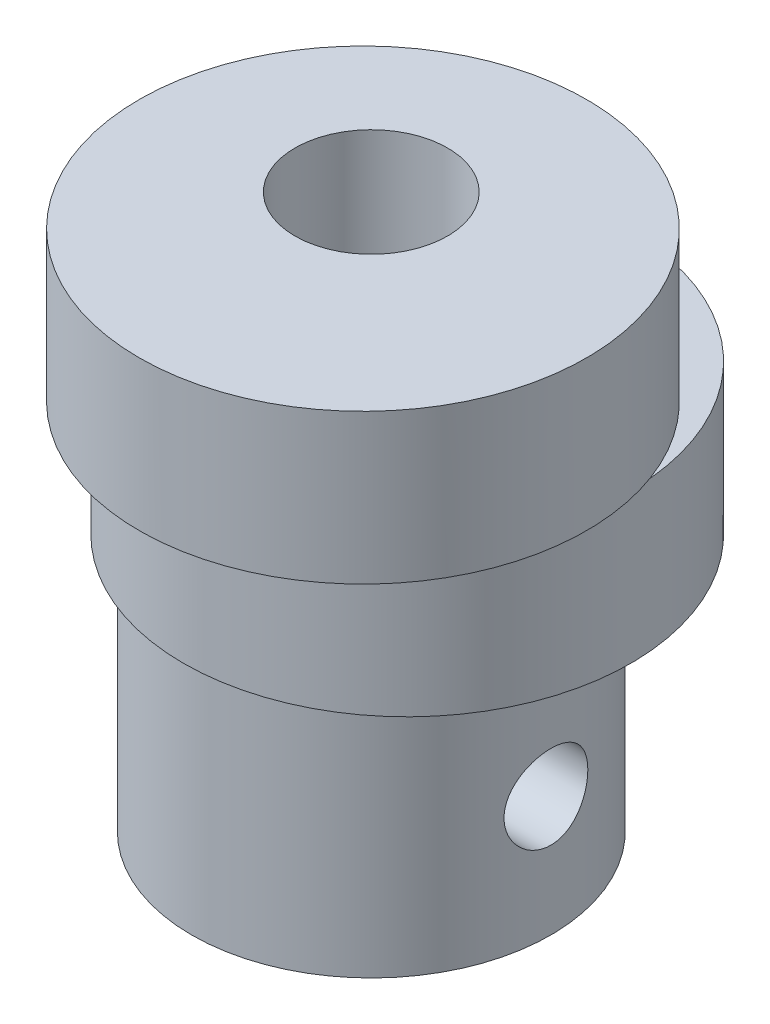
ISO-10303-21;
HEADER;
FILE_DESCRIPTION(('STEP AP214'),'2;1');
FILE_NAME('part.step','',(''),(''),'','','');
FILE_SCHEMA(('AUTOMOTIVE_DESIGN { 1 0 10303 214 1 1 1 1 }'));
ENDSEC;
DATA;
#1=APPLICATION_CONTEXT('core data for automotive mechanical design processes');
#2=APPLICATION_PROTOCOL_DEFINITION('international standard','automotive_design',2000,#1);
#3=PRODUCT_CONTEXT('',#1,'mechanical');
#4=PRODUCT('Part','Part','',(#3));
#5=PRODUCT_RELATED_PRODUCT_CATEGORY('part','',(#4));
#6=PRODUCT_DEFINITION_FORMATION('','',#4);
#7=PRODUCT_DEFINITION_CONTEXT('part definition',#1,'design');
#8=PRODUCT_DEFINITION('design','',#6,#7);
#9=PRODUCT_DEFINITION_SHAPE('','',#8);
#10=(LENGTH_UNIT() NAMED_UNIT(*) SI_UNIT(.MILLI.,.METRE.));
#11=(NAMED_UNIT(*) PLANE_ANGLE_UNIT() SI_UNIT($,.RADIAN.));
#12=(NAMED_UNIT(*) SI_UNIT($,.STERADIAN.) SOLID_ANGLE_UNIT());
#13=UNCERTAINTY_MEASURE_WITH_UNIT(LENGTH_MEASURE(1.E-05),#10,'distance_accuracy_value','');
#14=(GEOMETRIC_REPRESENTATION_CONTEXT(3) GLOBAL_UNCERTAINTY_ASSIGNED_CONTEXT((#13)) GLOBAL_UNIT_ASSIGNED_CONTEXT((#10,
#11,#12)) REPRESENTATION_CONTEXT('',''));
#15=CARTESIAN_POINT('',(0.,0.,0.));
#16=DIRECTION('',(0.,0.,1.));
#17=DIRECTION('',(1.,0.,0.));
#18=AXIS2_PLACEMENT_3D('',#15,#16,#17);
#19=CARTESIAN_POINT('',(0.,8.,0.));
#20=DIRECTION('',(0.,-1.,0.));
#21=DIRECTION('',(0.,0.,-1.));
#22=AXIS2_PLACEMENT_3D('',#19,#20,#21);
#23=CYLINDRICAL_SURFACE('',#22,6.);
#24=CARTESIAN_POINT('',(-5.83438085832593,4.,-1.4));
#25=CARTESIAN_POINT('',(-5.83438240713305,4.07748127009628,-1.39999752897121));
#26=CARTESIAN_POINT('',(-5.83594113113471,4.15499113191502,-1.39354594762189));
#27=CARTESIAN_POINT('',(-5.84199416300749,4.30779688786216,-1.36794409538363));
#28=CARTESIAN_POINT('',(-5.84649040504597,4.38309128909226,-1.34878545758606));
#29=CARTESIAN_POINT('',(-5.85788215378785,4.52923375884606,-1.29841363127606));
#30=CARTESIAN_POINT('',(-5.86477481840199,4.60008697752087,-1.26721471739009));
#31=CARTESIAN_POINT('',(-5.88017931416204,4.73555802594805,-1.19369008059532));
#32=CARTESIAN_POINT('',(-5.88869115868398,4.80017580418284,-1.15136426576614));
#33=CARTESIAN_POINT('',(-5.90655766331575,4.92258246312702,-1.05592042422923));
#34=CARTESIAN_POINT('',(-5.91592434176156,4.98023411003338,-1.00262861273496));
#35=CARTESIAN_POINT('',(-5.93434035204426,5.08586688279051,-0.887140338106091));
#36=CARTESIAN_POINT('',(-5.94338965698452,5.13384719064705,-0.824943122519716));
#37=CARTESIAN_POINT('',(-5.96028315816151,5.21932659709147,-0.692480344845557));
#38=CARTESIAN_POINT('',(-5.96811151728704,5.25669241741224,-0.622126583128503));
#39=CARTESIAN_POINT('',(-5.98154471284947,5.31901797306193,-0.475924410658289));
#40=CARTESIAN_POINT('',(-5.98714983396844,5.34397929687038,-0.400076704867757));
#41=CARTESIAN_POINT('',(-5.99542006442471,5.38035207007691,-0.246468422948656));
#42=CARTESIAN_POINT('',(-5.99813559050782,5.39199615381926,-0.168765692836243));
#43=CARTESIAN_POINT('',(-6.00049580147819,5.40213256194694,-0.0124654307432515));
#44=CARTESIAN_POINT('',(-6.000140884059,5.40062658956885,0.0661319840379752));
#45=CARTESIAN_POINT('',(-5.99643827775144,5.38467621607323,0.22038243403317));
#46=CARTESIAN_POINT('',(-5.9931486277782,5.37048271968994,0.296063014483886));
#47=CARTESIAN_POINT('',(-5.98401294997535,5.32996158795322,0.443937351340516));
#48=CARTESIAN_POINT('',(-5.97816679666005,5.30363335696424,0.516130936394457));
#49=CARTESIAN_POINT('',(-5.96448369445457,5.23937681779177,0.655662411374694));
#50=CARTESIAN_POINT('',(-5.95663096457973,5.20135604592128,0.722956109240957));
#51=CARTESIAN_POINT('',(-5.93979166468828,5.11486315175258,0.850298043438957));
#52=CARTESIAN_POINT('',(-5.93080492066729,5.0663894247306,0.910345165075966));
#53=CARTESIAN_POINT('',(-5.91243116839085,4.95900986814144,1.02298382065534));
#54=CARTESIAN_POINT('',(-5.90303972002647,4.89988454653532,1.0753655893591));
#55=CARTESIAN_POINT('',(-5.88511193509137,4.77359071209639,1.16951315096307));
#56=CARTESIAN_POINT('',(-5.87657562866398,4.70642191591817,1.21127856972193));
#57=CARTESIAN_POINT('',(-5.86131086901547,4.56557629197206,1.28311928066036));
#58=CARTESIAN_POINT('',(-5.85458932713218,4.49187596565162,1.31315007157412));
#59=CARTESIAN_POINT('',(-5.84380727037895,4.34027963196071,1.36033399651697));
#60=CARTESIAN_POINT('',(-5.83974626809562,4.26238439593306,1.3774894893968));
#61=CARTESIAN_POINT('',(-5.83484585305818,4.10653908474137,1.39810032473933));
#62=CARTESIAN_POINT('',(-5.8339341319395,4.02863191027216,1.40186322729132));
#63=CARTESIAN_POINT('',(-5.83523964902541,3.87330328697474,1.39641897695547));
#64=CARTESIAN_POINT('',(-5.83745663986124,3.79588180023219,1.38721284945225));
#65=CARTESIAN_POINT('',(-5.84470103750626,3.64482497046983,1.35636003740989));
#66=CARTESIAN_POINT('',(-5.8496891723475,3.57115208493532,1.33488707764707));
#67=CARTESIAN_POINT('',(-5.86187755455804,3.42845039771517,1.28030025935677));
#68=CARTESIAN_POINT('',(-5.86907803707116,3.35942209063901,1.24718516336753));
#69=CARTESIAN_POINT('',(-5.88503566856558,3.22665057854113,1.16959187555837));
#70=CARTESIAN_POINT('',(-5.89381762819068,3.16301967278477,1.12492673697715));
#71=CARTESIAN_POINT('',(-5.91188538119269,3.04404319887724,1.02574210184502));
#72=CARTESIAN_POINT('',(-5.92117124609802,2.98869881119544,0.971221203713207));
#73=CARTESIAN_POINT('',(-5.93944192292914,2.88664918774636,0.85247191256235));
#74=CARTESIAN_POINT('',(-5.94841598440836,2.84015504719718,0.788060164078878));
#75=CARTESIAN_POINT('',(-5.96484373962347,2.75864582524921,0.652162995697992));
#76=CARTESIAN_POINT('',(-5.97229750893382,2.72363017319661,0.580677927681216));
#77=CARTESIAN_POINT('',(-5.98480005739952,2.66635408127874,0.433135725189761));
#78=CARTESIAN_POINT('',(-5.98986510691081,2.64400713336923,0.35711361575605));
#79=CARTESIAN_POINT('',(-5.99709029613555,2.61243681056742,0.202261185265154));
#80=CARTESIAN_POINT('',(-5.9992509199578,2.60321124859157,0.123431334450482));
#81=CARTESIAN_POINT('',(-6.00040699871177,2.59825516605721,-0.0328046344139635));
#82=CARTESIAN_POINT('',(-5.99947597571806,2.60221118367551,-0.110200426877641));
#83=CARTESIAN_POINT('',(-5.99471338137433,2.62279722469367,-0.263191681222009));
#84=CARTESIAN_POINT('',(-5.99088187680089,2.63942695631198,-0.338787184508677));
#85=CARTESIAN_POINT('',(-5.98075700496624,2.68472970825951,-0.485750585480169));
#86=CARTESIAN_POINT('',(-5.97447387330707,2.71335269269399,-0.557134657732929));
#87=CARTESIAN_POINT('',(-5.96011229736764,2.78178262774409,-0.694125881671262));
#88=CARTESIAN_POINT('',(-5.95203365402622,2.82159081854802,-0.759732391694803));
#89=CARTESIAN_POINT('',(-5.93474308040959,2.91225344870422,-0.884816433492555));
#90=CARTESIAN_POINT('',(-5.92551069348074,2.96332490929113,-0.944133846970399));
#91=CARTESIAN_POINT('',(-5.90705477759142,3.07463390254468,-1.05346330371257));
#92=CARTESIAN_POINT('',(-5.89783125136838,3.13487368674433,-1.10347305450114));
#93=CARTESIAN_POINT('',(-5.88027451979457,3.26394663161854,-1.19353045744998));
#94=CARTESIAN_POINT('',(-5.87195754966424,3.33289976705906,-1.23340953731453));
#95=CARTESIAN_POINT('',(-5.85736566955804,3.47671240943205,-1.30094971958484));
#96=CARTESIAN_POINT('',(-5.85108913982645,3.55156717255043,-1.32862051951041));
#97=CARTESIAN_POINT('',(-5.84236938910376,3.68867500034257,-1.36638441859385));
#98=CARTESIAN_POINT('',(-5.83939473958381,3.75022122426246,-1.37896464197831));
#99=CARTESIAN_POINT('',(-5.83539990897484,3.87450543033199,-1.39577316839126));
#100=CARTESIAN_POINT('',(-5.83437960385543,3.93724333659756,-1.40000200143237));
#101=CARTESIAN_POINT('',(-5.83438085832593,4.,-1.4));
#102=B_SPLINE_CURVE_WITH_KNOTS('',3,(#24,#25,#26,#27,#28,#29,#30,#31,#32,#33,#34,#35,#36,#37,
#38,#39,#40,#41,#42,#43,#44,#45,#46,#47,#48,#49,#50,#51,#52,#53,#54,#55,#56,#57,#58,#59,#60,#61,
#62,#63,#64,#65,#66,#67,#68,#69,#70,#71,#72,#73,#74,#75,#76,#77,#78,#79,#80,#81,#82,#83,#84,#85,
#86,#87,#88,#89,#90,#91,#92,#93,#94,#95,#96,#97,#98,#99,#100,#101),.UNSPECIFIED.,.T.,.F.,(4,2,2,
2,2,2,2,2,2,2,2,2,2,2,2,2,2,2,2,2,2,2,2,2,2,2,2,2,2,2,2,2,2,2,2,2,2,2,4),(0.,0.232213611218947,
0.464580274520692,0.696672292323001,0.928766227519193,1.16486909871888,1.40099193094167,
1.63996030370597,1.87889806706619,2.11359490303957,2.34826134079243,2.57838730313738,
2.80852456245816,3.04053068043832,3.27257244107759,3.51009871852548,3.74763336571324,
3.98606027106499,4.22444348415662,4.45731559480039,4.6901692946548,4.91980425978676,
5.14946364057931,5.3831023379425,5.61677428708265,5.85546531594788,6.09414447647271,
6.33117355760682,6.56816312590406,6.79955761512103,7.03094677720145,7.26138004633751,
7.49183887543995,7.72720146781136,7.96262195345586,8.20173528337683,8.44065833264115,
8.62875380868085,8.81683734704598),.UNSPECIFIED.);
#103=CARTESIAN_POINT('',(-5.83438085832593,4.,-1.4));
#104=VERTEX_POINT('',#103);
#105=EDGE_CURVE('E117',#104,#104,#102,.T.);
#106=ORIENTED_EDGE('',*,*,#105,.T.);
#107=EDGE_LOOP('',(#106));
#108=FACE_BOUND('',#107,.T.);
#109=CARTESIAN_POINT('',(5.83438085832593,4.,-1.4));
#110=CARTESIAN_POINT('',(5.83438240713305,3.92251872990372,-1.39999752897121));
#111=CARTESIAN_POINT('',(5.83594113113471,3.84500886808498,-1.39354594762189));
#112=CARTESIAN_POINT('',(5.84199416300749,3.69220311213784,-1.36794409538363));
#113=CARTESIAN_POINT('',(5.84649040504597,3.61690871090774,-1.34878545758606));
#114=CARTESIAN_POINT('',(5.85788215378785,3.47076624115394,-1.29841363127606));
#115=CARTESIAN_POINT('',(5.86477481840199,3.39991302247913,-1.26721471739009));
#116=CARTESIAN_POINT('',(5.88017931416204,3.26444197405195,-1.19369008059532));
#117=CARTESIAN_POINT('',(5.88869115868398,3.19982419581716,-1.15136426576614));
#118=CARTESIAN_POINT('',(5.90655766331575,3.07741753687298,-1.05592042422923));
#119=CARTESIAN_POINT('',(5.91592434176156,3.01976588996662,-1.00262861273496));
#120=CARTESIAN_POINT('',(5.93434035204426,2.91413311720949,-0.887140338106091));
#121=CARTESIAN_POINT('',(5.94338965698452,2.86615280935295,-0.824943122519716));
#122=CARTESIAN_POINT('',(5.96028315816151,2.78067340290853,-0.692480344845558));
#123=CARTESIAN_POINT('',(5.96811151728704,2.74330758258777,-0.622126583128503));
#124=CARTESIAN_POINT('',(5.98154471284947,2.68098202693807,-0.475924410658289));
#125=CARTESIAN_POINT('',(5.98714983396844,2.65602070312962,-0.400076704867757));
#126=CARTESIAN_POINT('',(5.99542006442471,2.61964792992309,-0.246468422948656));
#127=CARTESIAN_POINT('',(5.99813559050782,2.60800384618074,-0.168765692836243));
#128=CARTESIAN_POINT('',(6.00049580147819,2.59786743805306,-0.012465430743252));
#129=CARTESIAN_POINT('',(6.000140884059,2.59937341043115,0.0661319840379747));
#130=CARTESIAN_POINT('',(5.99643827775144,2.61532378392677,0.220382434033169));
#131=CARTESIAN_POINT('',(5.9931486277782,2.62951728031006,0.296063014483886));
#132=CARTESIAN_POINT('',(5.98401294997535,2.67003841204678,0.443937351340515));
#133=CARTESIAN_POINT('',(5.97816679666005,2.69636664303576,0.516130936394457));
#134=CARTESIAN_POINT('',(5.96448369445457,2.76062318220823,0.655662411374694));
#135=CARTESIAN_POINT('',(5.95663096457973,2.79864395407872,0.722956109240957));
#136=CARTESIAN_POINT('',(5.93979166468828,2.88513684824742,0.850298043438957));
#137=CARTESIAN_POINT('',(5.93080492066729,2.9336105752694,0.910345165075965));
#138=CARTESIAN_POINT('',(5.91243116839085,3.04099013185856,1.02298382065534));
#139=CARTESIAN_POINT('',(5.90303972002647,3.10011545346468,1.0753655893591));
#140=CARTESIAN_POINT('',(5.88511193509137,3.22640928790361,1.16951315096307));
#141=CARTESIAN_POINT('',(5.87657562866398,3.29357808408183,1.21127856972193));
#142=CARTESIAN_POINT('',(5.86131086901547,3.43442370802794,1.28311928066036));
#143=CARTESIAN_POINT('',(5.85458932713218,3.50812403434838,1.31315007157412));
#144=CARTESIAN_POINT('',(5.84380727037895,3.65972036803929,1.36033399651696));
#145=CARTESIAN_POINT('',(5.83974626809562,3.73761560406694,1.3774894893968));
#146=CARTESIAN_POINT('',(5.83484585305818,3.89346091525863,1.39810032473933));
#147=CARTESIAN_POINT('',(5.8339341319395,3.97136808972784,1.40186322729132));
#148=CARTESIAN_POINT('',(5.83523964902541,4.12669671302526,1.39641897695547));
#149=CARTESIAN_POINT('',(5.83745663986124,4.20411819976781,1.38721284945225));
#150=CARTESIAN_POINT('',(5.84470103750626,4.35517502953017,1.35636003740989));
#151=CARTESIAN_POINT('',(5.8496891723475,4.42884791506468,1.33488707764707));
#152=CARTESIAN_POINT('',(5.86187755455804,4.57154960228482,1.28030025935678));
#153=CARTESIAN_POINT('',(5.86907803707116,4.64057790936099,1.24718516336753));
#154=CARTESIAN_POINT('',(5.88503566856558,4.77334942145887,1.16959187555837));
#155=CARTESIAN_POINT('',(5.89381762819068,4.83698032721523,1.12492673697715));
#156=CARTESIAN_POINT('',(5.91188538119269,4.95595680112276,1.02574210184502));
#157=CARTESIAN_POINT('',(5.92117124609802,5.01130118880456,0.971221203713207));
#158=CARTESIAN_POINT('',(5.93944192292914,5.11335081225364,0.85247191256235));
#159=CARTESIAN_POINT('',(5.94841598440837,5.15984495280282,0.788060164078878));
#160=CARTESIAN_POINT('',(5.96484373962347,5.24135417475079,0.652162995697993));
#161=CARTESIAN_POINT('',(5.97229750893382,5.27636982680339,0.580677927681216));
#162=CARTESIAN_POINT('',(5.98480005739952,5.33364591872126,0.433135725189762));
#163=CARTESIAN_POINT('',(5.98986510691081,5.35599286663077,0.357113615756051));
#164=CARTESIAN_POINT('',(5.99709029613555,5.38756318943258,0.202261185265155));
#165=CARTESIAN_POINT('',(5.9992509199578,5.39678875140843,0.123431334450483));
#166=CARTESIAN_POINT('',(6.00040699871177,5.40174483394279,-0.0328046344139624));
#167=CARTESIAN_POINT('',(5.99947597571806,5.39778881632449,-0.11020042687764));
#168=CARTESIAN_POINT('',(5.99471338137433,5.37720277530633,-0.263191681222008));
#169=CARTESIAN_POINT('',(5.99088187680089,5.36057304368802,-0.338787184508676));
#170=CARTESIAN_POINT('',(5.98075700496624,5.31527029174049,-0.485750585480168));
#171=CARTESIAN_POINT('',(5.97447387330707,5.28664730730601,-0.557134657732928));
#172=CARTESIAN_POINT('',(5.96011229736764,5.21821737225591,-0.694125881671261));
#173=CARTESIAN_POINT('',(5.95203365402622,5.17840918145198,-0.759732391694802));
#174=CARTESIAN_POINT('',(5.93474308040959,5.08774655129578,-0.884816433492554));
#175=CARTESIAN_POINT('',(5.92551069348074,5.03667509070887,-0.944133846970398));
#176=CARTESIAN_POINT('',(5.90705477759142,4.92536609745532,-1.05346330371257));
#177=CARTESIAN_POINT('',(5.89783125136838,4.86512631325567,-1.10347305450114));
#178=CARTESIAN_POINT('',(5.88027451979457,4.73605336838146,-1.19353045744998));
#179=CARTESIAN_POINT('',(5.87195754966424,4.66710023294094,-1.23340953731452));
#180=CARTESIAN_POINT('',(5.85736566955804,4.52328759056795,-1.30094971958484));
#181=CARTESIAN_POINT('',(5.85108913982645,4.44843282744957,-1.32862051951041));
#182=CARTESIAN_POINT('',(5.84236938910376,4.31132499965743,-1.36638441859384));
#183=CARTESIAN_POINT('',(5.8393947395838,4.24977877573754,-1.37896464197831));
#184=CARTESIAN_POINT('',(5.83539990897484,4.12549456966801,-1.39577316839126));
#185=CARTESIAN_POINT('',(5.83437960385543,4.06275666340244,-1.40000200143237));
#186=CARTESIAN_POINT('',(5.83438085832593,4.,-1.4));
#187=B_SPLINE_CURVE_WITH_KNOTS('',3,(#109,#110,#111,#112,#113,#114,#115,#116,#117,#118,#119,
#120,#121,#122,#123,#124,#125,#126,#127,#128,#129,#130,#131,#132,#133,#134,#135,#136,#137,#138,
#139,#140,#141,#142,#143,#144,#145,#146,#147,#148,#149,#150,#151,#152,#153,#154,#155,#156,#157,
#158,#159,#160,#161,#162,#163,#164,#165,#166,#167,#168,#169,#170,#171,#172,#173,#174,#175,#176,
#177,#178,#179,#180,#181,#182,#183,#184,#185,#186),.UNSPECIFIED.,.T.,.F.,(4,2,2,2,2,2,2,2,2,2,2,
2,2,2,2,2,2,2,2,2,2,2,2,2,2,2,2,2,2,2,2,2,2,2,2,2,2,2,4),(0.,0.232213611218947,
0.464580274520692,0.696672292323001,0.928766227519192,1.16486909871888,1.40099193094167,
1.63996030370597,1.87889806706619,2.11359490303957,2.34826134079243,2.57838730313738,
2.80852456245816,3.04053068043832,3.27257244107759,3.51009871852548,3.74763336571324,
3.98606027106499,4.22444348415662,4.45731559480039,4.6901692946548,4.91980425978676,
5.14946364057931,5.3831023379425,5.61677428708265,5.85546531594788,6.09414447647271,
6.33117355760682,6.56816312590406,6.79955761512103,7.03094677720145,7.26138004633751,
7.49183887543995,7.72720146781136,7.96262195345586,8.20173528337683,8.44065833264115,
8.62875380868085,8.81683734704598),.UNSPECIFIED.);
#188=CARTESIAN_POINT('',(5.83438085832593,4.,-1.4));
#189=VERTEX_POINT('',#188);
#190=EDGE_CURVE('E113',#189,#189,#187,.T.);
#191=ORIENTED_EDGE('',*,*,#190,.T.);
#192=EDGE_LOOP('',(#191));
#193=FACE_BOUND('',#192,.T.);
#194=CARTESIAN_POINT('',(0.,8.,0.));
#195=DIRECTION('',(0.,1.,0.));
#196=DIRECTION('',(0.,0.,1.));
#197=AXIS2_PLACEMENT_3D('',#194,#195,#196);
#198=CIRCLE('',#197,6.);
#199=CARTESIAN_POINT('',(0.,8.,6.));
#200=VERTEX_POINT('',#199);
#201=EDGE_CURVE('E54',#200,#200,#198,.T.);
#202=ORIENTED_EDGE('',*,*,#201,.F.);
#203=EDGE_LOOP('',(#202));
#204=FACE_BOUND('',#203,.T.);
#205=CARTESIAN_POINT('',(0.,0.,0.));
#206=DIRECTION('',(0.,1.,0.));
#207=DIRECTION('',(0.,0.,1.));
#208=AXIS2_PLACEMENT_3D('',#205,#206,#207);
#209=CIRCLE('',#208,6.);
#210=CARTESIAN_POINT('',(0.,0.,6.));
#211=VERTEX_POINT('',#210);
#212=EDGE_CURVE('E93',#211,#211,#209,.T.);
#213=ORIENTED_EDGE('',*,*,#212,.T.);
#214=EDGE_LOOP('',(#213));
#215=FACE_BOUND('',#214,.T.);
#216=ADVANCED_FACE('F41',(#108,#193,#204,#215),#23,.T.);
#217=CARTESIAN_POINT('',(0.,0.,0.));
#218=DIRECTION('',(0.,1.,0.));
#219=DIRECTION('',(0.,0.,1.));
#220=AXIS2_PLACEMENT_3D('',#217,#218,#219);
#221=PLANE('',#220);
#222=CARTESIAN_POINT('',(0.,0.,0.));
#223=DIRECTION('',(0.,1.,0.));
#224=DIRECTION('',(0.,0.,1.));
#225=AXIS2_PLACEMENT_3D('',#222,#223,#224);
#226=CIRCLE('',#225,2.55);
#227=CARTESIAN_POINT('',(0.,0.,2.55));
#228=VERTEX_POINT('',#227);
#229=EDGE_CURVE('E81',#228,#228,#226,.T.);
#230=ORIENTED_EDGE('',*,*,#229,.T.);
#231=EDGE_LOOP('',(#230));
#232=FACE_BOUND('',#231,.T.);
#233=ORIENTED_EDGE('',*,*,#212,.F.);
#234=EDGE_LOOP('',(#233));
#235=FACE_BOUND('',#234,.T.);
#236=ADVANCED_FACE('F148',(#232,#235),#221,.F.);
#237=CARTESIAN_POINT('',(0.,13.,-1.2));
#238=DIRECTION('',(0.,-1.,0.));
#239=DIRECTION('',(0.,0.,-1.));
#240=AXIS2_PLACEMENT_3D('',#237,#238,#239);
#241=CYLINDRICAL_SURFACE('',#240,7.475);
#242=CARTESIAN_POINT('',(0.,13.,-1.2));
#243=DIRECTION('',(0.,1.,0.));
#244=DIRECTION('',(0.,0.,1.));
#245=AXIS2_PLACEMENT_3D('',#242,#243,#244);
#246=CIRCLE('',#245,7.475);
#247=CARTESIAN_POINT('',(0.,13.,6.275));
#248=VERTEX_POINT('',#247);
#249=EDGE_CURVE('E86',#248,#248,#246,.T.);
#250=ORIENTED_EDGE('',*,*,#249,.F.);
#251=EDGE_LOOP('',(#250));
#252=FACE_BOUND('',#251,.T.);
#253=CARTESIAN_POINT('',(0.,8.,-1.2));
#254=DIRECTION('',(0.,1.,0.));
#255=DIRECTION('',(0.,0.,1.));
#256=AXIS2_PLACEMENT_3D('',#253,#254,#255);
#257=CIRCLE('',#256,7.475);
#258=CARTESIAN_POINT('',(0.,8.,6.275));
#259=VERTEX_POINT('',#258);
#260=EDGE_CURVE('E67',#259,#259,#257,.T.);
#261=ORIENTED_EDGE('',*,*,#260,.T.);
#262=EDGE_LOOP('',(#261));
#263=FACE_BOUND('',#262,.T.);
#264=ADVANCED_FACE('F151',(#252,#263),#241,.T.);
#265=CARTESIAN_POINT('',(0.,13.,-1.2));
#266=DIRECTION('',(0.,1.,0.));
#267=DIRECTION('',(0.,0.,1.));
#268=AXIS2_PLACEMENT_3D('',#265,#266,#267);
#269=PLANE('',#268);
#270=CARTESIAN_POINT('',(0.,13.,0.));
#271=DIRECTION('',(0.,1.,0.));
#272=DIRECTION('',(0.,0.,1.));
#273=AXIS2_PLACEMENT_3D('',#270,#271,#272);
#274=CIRCLE('',#273,6.);
#275=CARTESIAN_POINT('',(0.,13.,6.));
#276=VERTEX_POINT('',#275);
#277=EDGE_CURVE('E11',#276,#276,#274,.T.);
#278=ORIENTED_EDGE('',*,*,#277,.F.);
#279=EDGE_LOOP('',(#278));
#280=FACE_BOUND('',#279,.T.);
#281=ORIENTED_EDGE('',*,*,#249,.T.);
#282=EDGE_LOOP('',(#281));
#283=FACE_BOUND('',#282,.T.);
#284=ADVANCED_FACE('F164',(#280,#283),#269,.T.);
#285=CARTESIAN_POINT('',(0.,8.,-1.2));
#286=DIRECTION('',(0.,1.,0.));
#287=DIRECTION('',(0.,0.,1.));
#288=AXIS2_PLACEMENT_3D('',#285,#286,#287);
#289=PLANE('',#288);
#290=ORIENTED_EDGE('',*,*,#201,.T.);
#291=EDGE_LOOP('',(#290));
#292=FACE_BOUND('',#291,.T.);
#293=ORIENTED_EDGE('',*,*,#260,.F.);
#294=EDGE_LOOP('',(#293));
#295=FACE_BOUND('',#294,.T.);
#296=ADVANCED_FACE('F165',(#292,#295),#289,.F.);
#297=CARTESIAN_POINT('',(0.,13.5,0.));
#298=DIRECTION('',(0.,-1.,0.));
#299=DIRECTION('',(0.,0.,-1.));
#300=AXIS2_PLACEMENT_3D('',#297,#298,#299);
#301=CYLINDRICAL_SURFACE('',#300,6.);
#302=CARTESIAN_POINT('',(0.,13.5,0.));
#303=DIRECTION('',(0.,1.,0.));
#304=DIRECTION('',(0.,0.,1.));
#305=AXIS2_PLACEMENT_3D('',#302,#303,#304);
#306=CIRCLE('',#305,6.);
#307=CARTESIAN_POINT('',(-2.35898641897962,13.5,-5.51680913890174));
#308=VERTEX_POINT('',#307);
#309=CARTESIAN_POINT('',(-4.72014444347153,13.5,-3.70408375077627));
#310=VERTEX_POINT('',#309);
#311=EDGE_CURVE('E63',#308,#310,#306,.T.);
#312=ORIENTED_EDGE('',*,*,#311,.F.);
#313=EDGE_CURVE('E69',#310,#308,#306,.T.);
#314=ORIENTED_EDGE('',*,*,#313,.F.);
#315=EDGE_LOOP('',(#312,#314));
#316=FACE_BOUND('',#315,.T.);
#317=ORIENTED_EDGE('',*,*,#277,.T.);
#318=EDGE_LOOP('',(#317));
#319=FACE_BOUND('',#318,.T.);
#320=ADVANCED_FACE('F71',(#316,#319),#301,.T.);
#321=CARTESIAN_POINT('',(0.,13.5,0.));
#322=DIRECTION('',(0.,1.,0.));
#323=DIRECTION('',(0.,0.,1.));
#324=AXIS2_PLACEMENT_3D('',#321,#322,#323);
#325=PLANE('',#324);
#326=CARTESIAN_POINT('',(0.921272715839781,13.5,1.2));
#327=DIRECTION('',(0.,1.,0.));
#328=DIRECTION('',(0.,0.,1.));
#329=AXIS2_PLACEMENT_3D('',#326,#327,#328);
#330=CIRCLE('',#329,7.475);
#331=EDGE_CURVE('E61',#308,#310,#330,.T.);
#332=ORIENTED_EDGE('',*,*,#331,.F.);
#333=ORIENTED_EDGE('',*,*,#311,.T.);
#334=EDGE_LOOP('',(#332,#333));
#335=FACE_BOUND('',#334,.T.);
#336=ADVANCED_FACE('F66',(#335),#325,.T.);
#337=CARTESIAN_POINT('',(0.921272715839781,13.5,1.2));
#338=DIRECTION('',(0.,1.,0.));
#339=DIRECTION('',(0.,0.,1.));
#340=AXIS2_PLACEMENT_3D('',#337,#338,#339);
#341=PLANE('',#340);
#342=EDGE_CURVE('E80',#310,#308,#330,.T.);
#343=ORIENTED_EDGE('',*,*,#342,.F.);
#344=ORIENTED_EDGE('',*,*,#313,.T.);
#345=EDGE_LOOP('',(#343,#344));
#346=FACE_BOUND('',#345,.T.);
#347=ADVANCED_FACE('F78',(#346),#341,.F.);
#348=CARTESIAN_POINT('',(0.921272715839781,18.5,1.2));
#349=DIRECTION('',(0.,-1.,0.));
#350=DIRECTION('',(0.,0.,-1.));
#351=AXIS2_PLACEMENT_3D('',#348,#349,#350);
#352=CYLINDRICAL_SURFACE('',#351,7.475);
#353=CARTESIAN_POINT('',(0.921272715839781,18.5,1.2));
#354=DIRECTION('',(0.,1.,0.));
#355=DIRECTION('',(0.,0.,1.));
#356=AXIS2_PLACEMENT_3D('',#353,#354,#355);
#357=CIRCLE('',#356,7.475);
#358=CARTESIAN_POINT('',(0.921272715839781,18.5,8.675));
#359=VERTEX_POINT('',#358);
#360=EDGE_CURVE('E76',#359,#359,#357,.T.);
#361=ORIENTED_EDGE('',*,*,#360,.F.);
#362=EDGE_LOOP('',(#361));
#363=FACE_BOUND('',#362,.T.);
#364=ORIENTED_EDGE('',*,*,#331,.T.);
#365=ORIENTED_EDGE('',*,*,#342,.T.);
#366=EDGE_LOOP('',(#364,#365));
#367=FACE_BOUND('',#366,.T.);
#368=ADVANCED_FACE('F83',(#363,#367),#352,.T.);
#369=CARTESIAN_POINT('',(0.921272715839781,18.5,1.2));
#370=DIRECTION('',(0.,1.,0.));
#371=DIRECTION('',(0.,0.,1.));
#372=AXIS2_PLACEMENT_3D('',#369,#370,#371);
#373=PLANE('',#372);
#374=CARTESIAN_POINT('',(0.,18.5,0.));
#375=DIRECTION('',(0.,1.,0.));
#376=DIRECTION('',(0.,0.,1.));
#377=AXIS2_PLACEMENT_3D('',#374,#375,#376);
#378=CIRCLE('',#377,2.55);
#379=CARTESIAN_POINT('',(0.,18.5,2.55));
#380=VERTEX_POINT('',#379);
#381=EDGE_CURVE('E127',#380,#380,#378,.T.);
#382=ORIENTED_EDGE('',*,*,#381,.F.);
#383=EDGE_LOOP('',(#382));
#384=FACE_BOUND('',#383,.T.);
#385=ORIENTED_EDGE('',*,*,#360,.T.);
#386=EDGE_LOOP('',(#385));
#387=FACE_BOUND('',#386,.T.);
#388=ADVANCED_FACE('F131',(#384,#387),#373,.T.);
#389=CARTESIAN_POINT('',(0.,0.,0.));
#390=DIRECTION('',(0.,1.,0.));
#391=DIRECTION('',(0.,0.,1.));
#392=AXIS2_PLACEMENT_3D('',#389,#390,#391);
#393=CYLINDRICAL_SURFACE('',#392,2.55);
#394=CARTESIAN_POINT('',(-2.13131414859471,4.,-1.4));
#395=CARTESIAN_POINT('',(-2.13132173188022,3.92822535227016,-1.39999454561361));
#396=CARTESIAN_POINT('',(-2.13499714504008,3.85638735015988,-1.39444209874371));
#397=CARTESIAN_POINT('',(-2.14912453065686,3.71501186019296,-1.37256014678152));
#398=CARTESIAN_POINT('',(-2.15958797842535,3.64547847795109,-1.35621239115911));
#399=CARTESIAN_POINT('',(-2.18569235432001,3.5110399178006,-1.31371999296033));
#400=CARTESIAN_POINT('',(-2.20130103179859,3.4461088968415,-1.28763624478065));
#401=CARTESIAN_POINT('',(-2.23588477402607,3.32156895406738,-1.22659964775571));
#402=CARTESIAN_POINT('',(-2.25486053159056,3.26196113136366,-1.19164497297688));
#403=CARTESIAN_POINT('',(-2.29636197149888,3.14315475684876,-1.10974426072614));
#404=CARTESIAN_POINT('',(-2.31905271262662,3.08460164989162,-1.06194523882821));
#405=CARTESIAN_POINT('',(-2.3641025828218,2.97582532514606,-0.957474599765633));
#406=CARTESIAN_POINT('',(-2.386461506811,2.92560707818663,-0.900797726819648));
#407=CARTESIAN_POINT('',(-2.43060599477531,2.8307014568588,-0.77428128702055));
#408=CARTESIAN_POINT('',(-2.45217924752562,2.78685356501633,-0.703730758658153));
#409=CARTESIAN_POINT('',(-2.49008597354026,2.71194961915659,-0.554845624001006));
#410=CARTESIAN_POINT('',(-2.50642342323316,2.68088385240062,-0.476516984444268));
#411=CARTESIAN_POINT('',(-2.53081131099079,2.63513835080716,-0.321174891625369));
#412=CARTESIAN_POINT('',(-2.53943667772055,2.61931328148991,-0.244591161893161));
#413=CARTESIAN_POINT('',(-2.54961444133388,2.60067929306436,-0.0894129281584338));
#414=CARTESIAN_POINT('',(-2.551172177145,2.59786054887861,-0.010819987075233));
#415=CARTESIAN_POINT('',(-2.54726459927156,2.60498753255354,0.13733358870067));
#416=CARTESIAN_POINT('',(-2.5425151643531,2.61363200699225,0.20698096794794));
#417=CARTESIAN_POINT('',(-2.52767251571614,2.64104413034595,0.343652203268652));
#418=CARTESIAN_POINT('',(-2.51757889189978,2.65981255614624,0.410675857580959));
#419=CARTESIAN_POINT('',(-2.49280843848064,2.7069420662997,0.541174670361665));
#420=CARTESIAN_POINT('',(-2.47808309445794,2.73540496866949,0.604603466247627));
#421=CARTESIAN_POINT('',(-2.44530363738469,2.80091142530091,0.725908875888654));
#422=CARTESIAN_POINT('',(-2.4272484566213,2.83795773281251,0.783783699685937));
#423=CARTESIAN_POINT('',(-2.3871342543056,2.92411991602107,0.89899900601801));
#424=CARTESIAN_POINT('',(-2.36485345733158,2.97410558833316,0.955611855457661));
#425=CARTESIAN_POINT('',(-2.31990727669917,3.08244821215531,1.06008080058919));
#426=CARTESIAN_POINT('',(-2.29724152068533,3.14081372985201,1.10792782019952));
#427=CARTESIAN_POINT('',(-2.25184883072376,3.27039786739353,1.19767285599074));
#428=CARTESIAN_POINT('',(-2.22928921276045,3.34229368407071,1.23868718197823));
#429=CARTESIAN_POINT('',(-2.18948741415792,3.49340955932475,1.30776389830649));
#430=CARTESIAN_POINT('',(-2.17223909751684,3.57262102769744,1.33584125313934));
#431=CARTESIAN_POINT('',(-2.14712971687139,3.72953069970742,1.37581051692147));
#432=CARTESIAN_POINT('',(-2.13862250462674,3.80683357640545,1.38882737291029));
#433=CARTESIAN_POINT('',(-2.13021764764162,3.96295715305155,1.4016929600325));
#434=CARTESIAN_POINT('',(-2.13031025375941,4.04177603300433,1.40155660223515));
#435=CARTESIAN_POINT('',(-2.13840938217305,4.18644183768027,1.38914930709017));
#436=CARTESIAN_POINT('',(-2.14526979960434,4.25251669778656,1.37863559939163));
#437=CARTESIAN_POINT('',(-2.16429325216888,4.38178110159467,1.34857291905024));
#438=CARTESIAN_POINT('',(-2.17645859834561,4.44496937451223,1.32902000833812));
#439=CARTESIAN_POINT('',(-2.20528909019807,4.56978181103425,1.28063285770688));
#440=CARTESIAN_POINT('',(-2.22212280855118,4.63122675367457,1.25144100670651));
#441=CARTESIAN_POINT('',(-2.25830546947987,4.74871438969967,1.184901014774));
#442=CARTESIAN_POINT('',(-2.27765565715759,4.80475438475198,1.14754882999889));
#443=CARTESIAN_POINT('',(-2.3203490891688,4.9191100899918,1.05889690985968));
#444=CARTESIAN_POINT('',(-2.34384067362729,4.97638998797124,1.00632642510527));
#445=CARTESIAN_POINT('',(-2.38964093935872,5.08172764072994,0.892133958672754));
#446=CARTESIAN_POINT('',(-2.41194892805519,5.12978003821943,0.830506755286246));
#447=CARTESIAN_POINT('',(-2.45424431873848,5.21752487112436,0.695984116050773));
#448=CARTESIAN_POINT('',(-2.47405984766796,5.25667896411935,0.622679253880791));
#449=CARTESIAN_POINT('',(-2.50770219198471,5.32168350249266,0.469129807970396));
#450=CARTESIAN_POINT('',(-2.5215352145394,5.34754774206648,0.388892521229797));
#451=CARTESIAN_POINT('',(-2.54046954474604,5.3826345383718,0.23253949333148));
#452=CARTESIAN_POINT('',(-2.54631563858504,5.39328174367253,0.156834155374087));
#453=CARTESIAN_POINT('',(-2.55113199236675,5.40206659725698,0.00449675241170916));
#454=CARTESIAN_POINT('',(-2.55010584556516,5.40021078293195,-0.072134807384062));
#455=CARTESIAN_POINT('',(-2.54170106692946,5.38483838908138,-0.216907170897303));
#456=CARTESIAN_POINT('',(-2.53489499731216,5.3723725981847,-0.285197390160777));
#457=CARTESIAN_POINT('',(-2.51631642938178,5.3377449042492,-0.41855194266138));
#458=CARTESIAN_POINT('',(-2.50454333643116,5.31558184026936,-0.483615888615904));
#459=CARTESIAN_POINT('',(-2.47654868005504,5.26148592203437,-0.611248238105094));
#460=CARTESIAN_POINT('',(-2.46018798845225,5.22924314000316,-0.673653738434907));
#461=CARTESIAN_POINT('',(-2.42455964140184,5.15628812273821,-0.792375114885639));
#462=CARTESIAN_POINT('',(-2.40529080610399,5.11557244745261,-0.848688503409969));
#463=CARTESIAN_POINT('',(-2.36303525563996,5.02147104304081,-0.960484829960151));
#464=CARTESIAN_POINT('',(-2.33987562775544,4.96716759677495,-1.01513115119485));
#465=CARTESIAN_POINT('',(-2.29399442076669,4.85017981705008,-1.11495062855171));
#466=CARTESIAN_POINT('',(-2.2712734024069,4.78748547571257,-1.16011230441263));
#467=CARTESIAN_POINT('',(-2.22733527522559,4.65039396482092,-1.24249642934043));
#468=CARTESIAN_POINT('',(-2.2063147718163,4.57549875264188,-1.27900318580873));
#469=CARTESIAN_POINT('',(-2.17082192619946,4.41914998588581,-1.33837607051845));
#470=CARTESIAN_POINT('',(-2.15632871081766,4.33771833235085,-1.36128575570107));
#471=CARTESIAN_POINT('',(-2.14149343325653,4.21267900206191,-1.38440644007117));
#472=CARTESIAN_POINT('',(-2.13769862465381,4.17045301083711,-1.39023962265654));
#473=CARTESIAN_POINT('',(-2.1326067453031,4.08549216818797,-1.39803799361334));
#474=CARTESIAN_POINT('',(-2.13130963110813,4.04275732562802,-1.40000324926673));
#475=CARTESIAN_POINT('',(-2.13131414859471,4.,-1.4));
#476=B_SPLINE_CURVE_WITH_KNOTS('',3,(#394,#395,#396,#397,#398,#399,#400,#401,#402,#403,#404,
#405,#406,#407,#408,#409,#410,#411,#412,#413,#414,#415,#416,#417,#418,#419,#420,#421,#422,#423,
#424,#425,#426,#427,#428,#429,#430,#431,#432,#433,#434,#435,#436,#437,#438,#439,#440,#441,#442,
#443,#444,#445,#446,#447,#448,#449,#450,#451,#452,#453,#454,#455,#456,#457,#458,#459,#460,#461,
#462,#463,#464,#465,#466,#467,#468,#469,#470,#471,#472,#473,#474,#475),.UNSPECIFIED.,.T.,.F.,(4,
2,2,2,2,2,2,2,2,2,2,2,2,2,2,2,2,2,2,2,2,2,2,2,2,2,2,2,2,2,2,2,2,2,2,2,2,2,2,2,4),(0.,
0.215142462150753,0.43064957815121,0.644830781578509,0.859056106472185,1.09485010320296,
1.33078422375327,1.58688210380439,1.84278502205735,2.07746381345062,2.31196529763644,
2.5219970555528,2.73204493304542,2.94437062117948,3.15676451033541,3.39201324356143,
3.6275041919045,3.88354833285213,4.13929555349678,4.37436807937802,4.60917411970462,
4.81003263951553,5.01097874904829,5.22042479163472,5.42997486132087,5.67258482088145,
5.91533521154886,6.17022705493565,6.42485379632725,6.65359170051874,6.88221001495308,
7.09051408124163,7.29884309216494,7.51434048771298,7.7299255479599,7.97024605536921,
8.21085579242817,8.46725876609804,8.72283588052777,8.85100197565257,8.97916584132864),.UNSPECIFIED.);
#477=CARTESIAN_POINT('',(-2.13131414859471,4.,-1.4));
#478=VERTEX_POINT('',#477);
#479=EDGE_CURVE('E44',#478,#478,#476,.T.);
#480=ORIENTED_EDGE('',*,*,#479,.T.);
#481=EDGE_LOOP('',(#480));
#482=FACE_BOUND('',#481,.T.);
#483=CARTESIAN_POINT('',(2.13131414859471,4.,-1.4));
#484=CARTESIAN_POINT('',(2.13132173188022,4.07177464772984,-1.39999454561361));
#485=CARTESIAN_POINT('',(2.13499714504008,4.14361264984012,-1.39444209874371));
#486=CARTESIAN_POINT('',(2.14912453065686,4.28498813980704,-1.37256014678152));
#487=CARTESIAN_POINT('',(2.15958797842535,4.35452152204891,-1.35621239115911));
#488=CARTESIAN_POINT('',(2.18569235432001,4.4889600821994,-1.31371999296033));
#489=CARTESIAN_POINT('',(2.20130103179859,4.5538911031585,-1.28763624478065));
#490=CARTESIAN_POINT('',(2.23588477402607,4.67843104593262,-1.22659964775571));
#491=CARTESIAN_POINT('',(2.25486053159056,4.73803886863634,-1.19164497297688));
#492=CARTESIAN_POINT('',(2.29636197149888,4.85684524315124,-1.10974426072614));
#493=CARTESIAN_POINT('',(2.31905271262662,4.91539835010838,-1.06194523882821));
#494=CARTESIAN_POINT('',(2.3641025828218,5.02417467485394,-0.957474599765634));
#495=CARTESIAN_POINT('',(2.386461506811,5.07439292181337,-0.900797726819649));
#496=CARTESIAN_POINT('',(2.43060599477531,5.1692985431412,-0.77428128702055));
#497=CARTESIAN_POINT('',(2.45217924752562,5.21314643498367,-0.703730758658153));
#498=CARTESIAN_POINT('',(2.49008597354026,5.28805038084341,-0.554845624001006));
#499=CARTESIAN_POINT('',(2.50642342323316,5.31911614759938,-0.476516984444267));
#500=CARTESIAN_POINT('',(2.53081131099079,5.36486164919284,-0.321174891625369));
#501=CARTESIAN_POINT('',(2.53943667772055,5.38068671851009,-0.244591161893161));
#502=CARTESIAN_POINT('',(2.54961444133388,5.39932070693564,-0.0894129281584338));
#503=CARTESIAN_POINT('',(2.551172177145,5.40213945112139,-0.0108199870752329));
#504=CARTESIAN_POINT('',(2.54726459927156,5.39501246744646,0.13733358870067));
#505=CARTESIAN_POINT('',(2.5425151643531,5.38636799300775,0.20698096794794));
#506=CARTESIAN_POINT('',(2.52767251571614,5.35895586965405,0.343652203268652));
#507=CARTESIAN_POINT('',(2.51757889189978,5.34018744385376,0.410675857580959));
#508=CARTESIAN_POINT('',(2.49280843848064,5.2930579337003,0.541174670361666));
#509=CARTESIAN_POINT('',(2.47808309445794,5.26459503133051,0.604603466247628));
#510=CARTESIAN_POINT('',(2.44530363738469,5.19908857469909,0.725908875888654));
#511=CARTESIAN_POINT('',(2.4272484566213,5.16204226718749,0.783783699685937));
#512=CARTESIAN_POINT('',(2.3871342543056,5.07588008397893,0.89899900601801));
#513=CARTESIAN_POINT('',(2.36485345733158,5.02589441166684,0.955611855457661));
#514=CARTESIAN_POINT('',(2.31990727669917,4.91755178784469,1.06008080058919));
#515=CARTESIAN_POINT('',(2.29724152068533,4.85918627014799,1.10792782019952));
#516=CARTESIAN_POINT('',(2.25184883072376,4.72960213260648,1.19767285599074));
#517=CARTESIAN_POINT('',(2.22928921276046,4.65770631592929,1.23868718197823));
#518=CARTESIAN_POINT('',(2.18948741415792,4.50659044067525,1.30776389830649));
#519=CARTESIAN_POINT('',(2.17223909751684,4.42737897230256,1.33584125313934));
#520=CARTESIAN_POINT('',(2.14712971687139,4.27046930029258,1.37581051692147));
#521=CARTESIAN_POINT('',(2.13862250462674,4.19316642359455,1.38882737291029));
#522=CARTESIAN_POINT('',(2.13021764764162,4.03704284694845,1.4016929600325));
#523=CARTESIAN_POINT('',(2.13031025375941,3.95822396699567,1.40155660223515));
#524=CARTESIAN_POINT('',(2.13840938217305,3.81355816231973,1.38914930709017));
#525=CARTESIAN_POINT('',(2.14526979960434,3.74748330221344,1.37863559939163));
#526=CARTESIAN_POINT('',(2.16429325216888,3.61821889840533,1.34857291905024));
#527=CARTESIAN_POINT('',(2.17645859834561,3.55503062548777,1.32902000833812));
#528=CARTESIAN_POINT('',(2.20528909019807,3.43021818896575,1.28063285770688));
#529=CARTESIAN_POINT('',(2.22212280855118,3.36877324632543,1.25144100670651));
#530=CARTESIAN_POINT('',(2.25830546947987,3.25128561030033,1.184901014774));
#531=CARTESIAN_POINT('',(2.27765565715759,3.19524561524802,1.1475488299989));
#532=CARTESIAN_POINT('',(2.3203490891688,3.0808899100082,1.05889690985968));
#533=CARTESIAN_POINT('',(2.34384067362729,3.02361001202876,1.00632642510527));
#534=CARTESIAN_POINT('',(2.38964093935872,2.91827235927006,0.892133958672755));
#535=CARTESIAN_POINT('',(2.41194892805519,2.87021996178057,0.830506755286246));
#536=CARTESIAN_POINT('',(2.45424431873848,2.78247512887564,0.695984116050773));
#537=CARTESIAN_POINT('',(2.47405984766796,2.74332103588065,0.622679253880792));
#538=CARTESIAN_POINT('',(2.50770219198471,2.67831649750734,0.469129807970397));
#539=CARTESIAN_POINT('',(2.5215352145394,2.65245225793352,0.388892521229798));
#540=CARTESIAN_POINT('',(2.54046954474604,2.6173654616282,0.23253949333148));
#541=CARTESIAN_POINT('',(2.54631563858504,2.60671825632747,0.156834155374087));
#542=CARTESIAN_POINT('',(2.55113199236675,2.59793340274302,0.00449675241170912));
#543=CARTESIAN_POINT('',(2.55010584556516,2.59978921706805,-0.0721348073840621));
#544=CARTESIAN_POINT('',(2.54170106692946,2.61516161091862,-0.216907170897303));
#545=CARTESIAN_POINT('',(2.53489499731216,2.62762740181531,-0.285197390160777));
#546=CARTESIAN_POINT('',(2.51631642938178,2.6622550957508,-0.41855194266138));
#547=CARTESIAN_POINT('',(2.50454333643116,2.68441815973064,-0.483615888615904));
#548=CARTESIAN_POINT('',(2.47654868005504,2.73851407796563,-0.611248238105094));
#549=CARTESIAN_POINT('',(2.46018798845225,2.77075685999684,-0.673653738434907));
#550=CARTESIAN_POINT('',(2.42455964140184,2.84371187726179,-0.792375114885639));
#551=CARTESIAN_POINT('',(2.40529080610399,2.88442755254739,-0.848688503409969));
#552=CARTESIAN_POINT('',(2.36303525563996,2.97852895695919,-0.960484829960151));
#553=CARTESIAN_POINT('',(2.33987562775544,3.03283240322505,-1.01513115119485));
#554=CARTESIAN_POINT('',(2.29399442076669,3.14982018294992,-1.11495062855171));
#555=CARTESIAN_POINT('',(2.2712734024069,3.21251452428743,-1.16011230441263));
#556=CARTESIAN_POINT('',(2.22733527522559,3.34960603517908,-1.24249642934043));
#557=CARTESIAN_POINT('',(2.2063147718163,3.42450124735812,-1.27900318580873));
#558=CARTESIAN_POINT('',(2.17082192619946,3.58085001411419,-1.33837607051845));
#559=CARTESIAN_POINT('',(2.15632871081766,3.66228166764915,-1.36128575570107));
#560=CARTESIAN_POINT('',(2.14149343325653,3.78732099793809,-1.38440644007117));
#561=CARTESIAN_POINT('',(2.13769862465381,3.82954698916289,-1.39023962265654));
#562=CARTESIAN_POINT('',(2.13260674530311,3.91450783181204,-1.39803799361334));
#563=CARTESIAN_POINT('',(2.13130963110813,3.95724267437198,-1.40000324926673));
#564=CARTESIAN_POINT('',(2.13131414859471,4.,-1.4));
#565=B_SPLINE_CURVE_WITH_KNOTS('',3,(#483,#484,#485,#486,#487,#488,#489,#490,#491,#492,#493,
#494,#495,#496,#497,#498,#499,#500,#501,#502,#503,#504,#505,#506,#507,#508,#509,#510,#511,#512,
#513,#514,#515,#516,#517,#518,#519,#520,#521,#522,#523,#524,#525,#526,#527,#528,#529,#530,#531,
#532,#533,#534,#535,#536,#537,#538,#539,#540,#541,#542,#543,#544,#545,#546,#547,#548,#549,#550,
#551,#552,#553,#554,#555,#556,#557,#558,#559,#560,#561,#562,#563,#564),.UNSPECIFIED.,.T.,.F.,(4,
2,2,2,2,2,2,2,2,2,2,2,2,2,2,2,2,2,2,2,2,2,2,2,2,2,2,2,2,2,2,2,2,2,2,2,2,2,2,2,4),(0.,
0.215142462150754,0.43064957815121,0.644830781578508,0.859056106472185,1.09485010320296,
1.33078422375327,1.58688210380439,1.84278502205735,2.07746381345062,2.31196529763644,
2.5219970555528,2.73204493304542,2.94437062117948,3.15676451033541,3.39201324356143,
3.6275041919045,3.88354833285213,4.13929555349678,4.37436807937802,4.60917411970462,
4.81003263951553,5.01097874904829,5.22042479163472,5.42997486132087,5.67258482088145,
5.91533521154886,6.17022705493565,6.42485379632725,6.65359170051874,6.88221001495308,
7.09051408124163,7.29884309216494,7.51434048771298,7.7299255479599,7.97024605536921,
8.21085579242817,8.46725876609804,8.72283588052778,8.85100197565257,8.97916584132864),.UNSPECIFIED.);
#566=CARTESIAN_POINT('',(2.13131414859471,4.,-1.4));
#567=VERTEX_POINT('',#566);
#568=EDGE_CURVE('E100',#567,#567,#565,.T.);
#569=ORIENTED_EDGE('',*,*,#568,.T.);
#570=EDGE_LOOP('',(#569));
#571=FACE_BOUND('',#570,.T.);
#572=ORIENTED_EDGE('',*,*,#229,.F.);
#573=EDGE_LOOP('',(#572));
#574=FACE_BOUND('',#573,.T.);
#575=ORIENTED_EDGE('',*,*,#381,.T.);
#576=EDGE_LOOP('',(#575));
#577=FACE_BOUND('',#576,.T.);
#578=ADVANCED_FACE('F105',(#482,#571,#574,#577),#393,.F.);
#579=CARTESIAN_POINT('',(-7.475,4.,0.));
#580=DIRECTION('',(1.,0.,0.));
#581=DIRECTION('',(0.,0.,-1.));
#582=AXIS2_PLACEMENT_3D('',#579,#580,#581);
#583=CYLINDRICAL_SURFACE('',#582,1.4);
#584=ORIENTED_EDGE('',*,*,#568,.F.);
#585=EDGE_LOOP('',(#584));
#586=FACE_BOUND('',#585,.T.);
#587=ORIENTED_EDGE('',*,*,#190,.F.);
#588=EDGE_LOOP('',(#587));
#589=FACE_BOUND('',#588,.T.);
#590=ADVANCED_FACE('F107',(#586,#589),#583,.F.);
#591=ORIENTED_EDGE('',*,*,#479,.F.);
#592=EDGE_LOOP('',(#591));
#593=FACE_BOUND('',#592,.T.);
#594=ORIENTED_EDGE('',*,*,#105,.F.);
#595=EDGE_LOOP('',(#594));
#596=FACE_BOUND('',#595,.T.);
#597=ADVANCED_FACE('F104',(#593,#596),#583,.F.);
#598=CLOSED_SHELL('',(#216,#236,#264,#284,#296,#320,#336,#347,#368,#388,#578,#590,#597));
#599=MANIFOLD_SOLID_BREP('B2',#598);
#600=ADVANCED_BREP_SHAPE_REPRESENTATION('',(#18,#599),#14);
#601=SHAPE_DEFINITION_REPRESENTATION(#9,#600);
ENDSEC;
END-ISO-10303-21;
